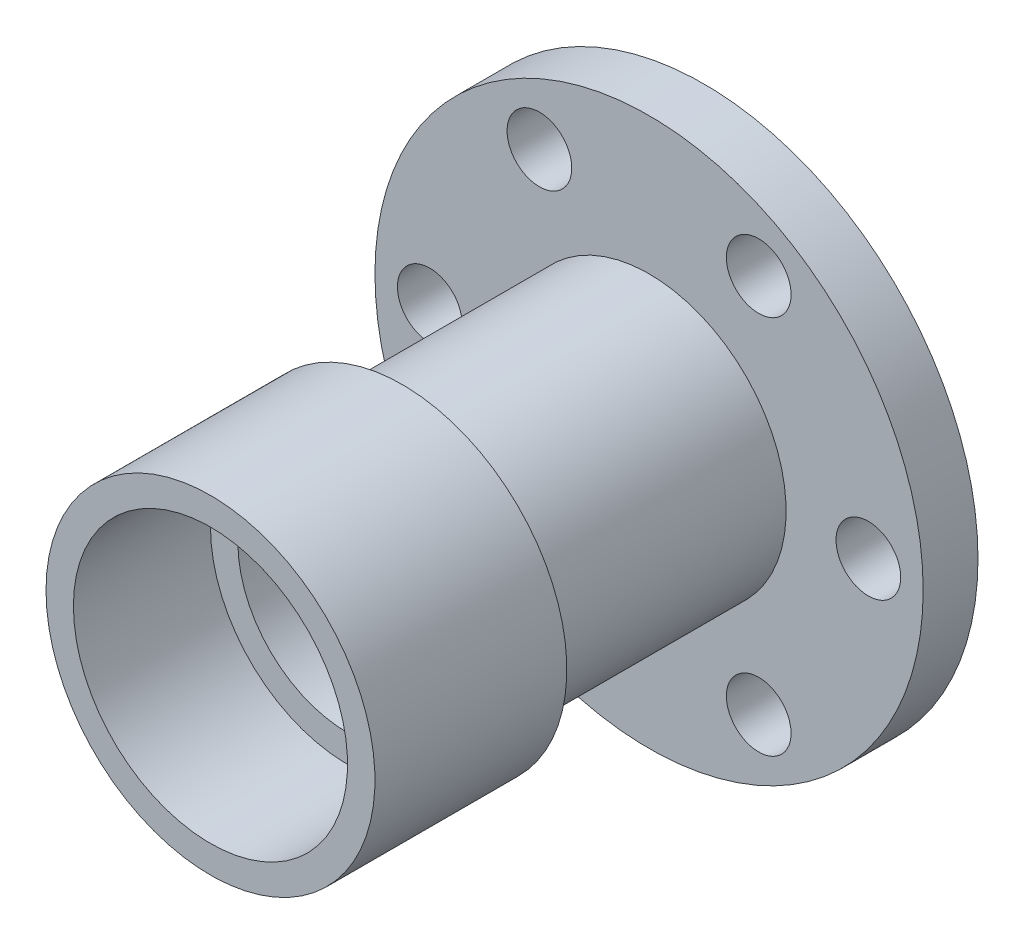
ISO-10303-21;
HEADER;
FILE_DESCRIPTION(('STEP AP214'),'2;1');
FILE_NAME('part.step','',(''),(''),'','','');
FILE_SCHEMA(('AUTOMOTIVE_DESIGN { 1 0 10303 214 1 1 1 1 }'));
ENDSEC;
DATA;
#1=APPLICATION_CONTEXT('core data for automotive mechanical design processes');
#2=APPLICATION_PROTOCOL_DEFINITION('international standard','automotive_design',2000,#1);
#3=PRODUCT_CONTEXT('',#1,'mechanical');
#4=PRODUCT('Part','Part','',(#3));
#5=PRODUCT_RELATED_PRODUCT_CATEGORY('part','',(#4));
#6=PRODUCT_DEFINITION_FORMATION('','',#4);
#7=PRODUCT_DEFINITION_CONTEXT('part definition',#1,'design');
#8=PRODUCT_DEFINITION('design','',#6,#7);
#9=PRODUCT_DEFINITION_SHAPE('','',#8);
#10=(LENGTH_UNIT() NAMED_UNIT(*) SI_UNIT(.MILLI.,.METRE.));
#11=(NAMED_UNIT(*) PLANE_ANGLE_UNIT() SI_UNIT($,.RADIAN.));
#12=(NAMED_UNIT(*) SI_UNIT($,.STERADIAN.) SOLID_ANGLE_UNIT());
#13=UNCERTAINTY_MEASURE_WITH_UNIT(LENGTH_MEASURE(1.E-05),#10,'distance_accuracy_value','');
#14=(GEOMETRIC_REPRESENTATION_CONTEXT(3) GLOBAL_UNCERTAINTY_ASSIGNED_CONTEXT((#13)) GLOBAL_UNIT_ASSIGNED_CONTEXT((#10,
#11,#12)) REPRESENTATION_CONTEXT('',''));
#15=CARTESIAN_POINT('',(0.,0.,0.));
#16=DIRECTION('',(0.,0.,1.));
#17=DIRECTION('',(1.,0.,0.));
#18=AXIS2_PLACEMENT_3D('',#15,#16,#17);
#19=CARTESIAN_POINT('',(0.,0.,0.));
#20=DIRECTION('',(0.,0.,-1.));
#21=DIRECTION('',(-1.,0.,0.));
#22=AXIS2_PLACEMENT_3D('',#19,#20,#21);
#23=CYLINDRICAL_SURFACE('',#22,50.);
#24=CARTESIAN_POINT('',(0.,0.,10.));
#25=DIRECTION('',(0.,0.,-1.));
#26=DIRECTION('',(-1.,0.,0.));
#27=AXIS2_PLACEMENT_3D('',#24,#25,#26);
#28=CIRCLE('',#27,50.);
#29=CARTESIAN_POINT('',(-50.,0.,10.));
#30=VERTEX_POINT('',#29);
#31=EDGE_CURVE('E10',#30,#30,#28,.T.);
#32=ORIENTED_EDGE('',*,*,#31,.T.);
#33=EDGE_LOOP('',(#32));
#34=FACE_BOUND('',#33,.T.);
#35=CARTESIAN_POINT('',(0.,0.,0.));
#36=DIRECTION('',(0.,0.,-1.));
#37=DIRECTION('',(-1.,0.,0.));
#38=AXIS2_PLACEMENT_3D('',#35,#36,#37);
#39=CIRCLE('',#38,50.);
#40=CARTESIAN_POINT('',(-50.,0.,0.));
#41=VERTEX_POINT('',#40);
#42=EDGE_CURVE('E69',#41,#41,#39,.T.);
#43=ORIENTED_EDGE('',*,*,#42,.F.);
#44=EDGE_LOOP('',(#43));
#45=FACE_BOUND('',#44,.T.);
#46=ADVANCED_FACE('F35',(#34,#45),#23,.T.);
#47=CARTESIAN_POINT('',(0.,50.,10.));
#48=DIRECTION('',(0.,0.,1.));
#49=DIRECTION('',(1.,0.,0.));
#50=AXIS2_PLACEMENT_3D('',#47,#48,#49);
#51=PLANE('',#50);
#52=CARTESIAN_POINT('',(40.,0.,10.));
#53=DIRECTION('',(0.,0.,1.));
#54=DIRECTION('',(1.,0.,0.));
#55=AXIS2_PLACEMENT_3D('',#52,#53,#54);
#56=CIRCLE('',#55,5.9);
#57=CARTESIAN_POINT('',(45.9,0.,10.));
#58=VERTEX_POINT('',#57);
#59=EDGE_CURVE('E96',#58,#58,#56,.T.);
#60=ORIENTED_EDGE('',*,*,#59,.F.);
#61=EDGE_LOOP('',(#60));
#62=FACE_BOUND('',#61,.T.);
#63=CARTESIAN_POINT('',(20.0000000000004,34.6410161513773,10.));
#64=DIRECTION('',(0.,0.,1.));
#65=DIRECTION('',(1.,0.,0.));
#66=AXIS2_PLACEMENT_3D('',#63,#64,#65);
#67=CIRCLE('',#66,5.9);
#68=CARTESIAN_POINT('',(25.9000000000004,34.6410161513773,10.));
#69=VERTEX_POINT('',#68);
#70=EDGE_CURVE('E101',#69,#69,#67,.T.);
#71=ORIENTED_EDGE('',*,*,#70,.F.);
#72=EDGE_LOOP('',(#71));
#73=FACE_BOUND('',#72,.T.);
#74=CARTESIAN_POINT('',(-20.,34.6410161513775,10.));
#75=DIRECTION('',(0.,0.,1.));
#76=DIRECTION('',(1.,0.,0.));
#77=AXIS2_PLACEMENT_3D('',#74,#75,#76);
#78=CIRCLE('',#77,5.89999999999988);
#79=CARTESIAN_POINT('',(-14.1000000000001,34.6410161513775,10.));
#80=VERTEX_POINT('',#79);
#81=EDGE_CURVE('E77',#80,#80,#78,.T.);
#82=ORIENTED_EDGE('',*,*,#81,.F.);
#83=EDGE_LOOP('',(#82));
#84=FACE_BOUND('',#83,.T.);
#85=CARTESIAN_POINT('',(-40.,2.79318507107451E-13,10.));
#86=DIRECTION('',(0.,0.,1.));
#87=DIRECTION('',(1.,0.,0.));
#88=AXIS2_PLACEMENT_3D('',#85,#86,#87);
#89=CIRCLE('',#88,5.9);
#90=CARTESIAN_POINT('',(-34.1,2.79318507107451E-13,10.));
#91=VERTEX_POINT('',#90);
#92=EDGE_CURVE('E76',#91,#91,#89,.T.);
#93=ORIENTED_EDGE('',*,*,#92,.F.);
#94=EDGE_LOOP('',(#93));
#95=FACE_BOUND('',#94,.T.);
#96=CARTESIAN_POINT('',(-20.0000000000002,-34.6410161513775,10.));
#97=DIRECTION('',(0.,0.,1.));
#98=DIRECTION('',(1.,0.,0.));
#99=AXIS2_PLACEMENT_3D('',#96,#97,#98);
#100=CIRCLE('',#99,5.9);
#101=CARTESIAN_POINT('',(-14.1000000000002,-34.6410161513775,10.));
#102=VERTEX_POINT('',#101);
#103=EDGE_CURVE('E84',#102,#102,#100,.T.);
#104=ORIENTED_EDGE('',*,*,#103,.F.);
#105=EDGE_LOOP('',(#104));
#106=FACE_BOUND('',#105,.T.);
#107=CARTESIAN_POINT('',(19.9999999999999,-34.6410161513776,10.));
#108=DIRECTION('',(0.,0.,1.));
#109=DIRECTION('',(1.,0.,0.));
#110=AXIS2_PLACEMENT_3D('',#107,#108,#109);
#111=CIRCLE('',#110,5.9);
#112=CARTESIAN_POINT('',(25.8999999999999,-34.6410161513776,10.));
#113=VERTEX_POINT('',#112);
#114=EDGE_CURVE('E90',#113,#113,#111,.T.);
#115=ORIENTED_EDGE('',*,*,#114,.F.);
#116=EDGE_LOOP('',(#115));
#117=FACE_BOUND('',#116,.T.);
#118=CARTESIAN_POINT('',(0.,0.,10.));
#119=DIRECTION('',(0.,0.,-1.));
#120=DIRECTION('',(-1.,0.,0.));
#121=AXIS2_PLACEMENT_3D('',#118,#119,#120);
#122=CIRCLE('',#121,25.);
#123=CARTESIAN_POINT('',(-25.,0.,10.));
#124=VERTEX_POINT('',#123);
#125=EDGE_CURVE('E41',#124,#124,#122,.T.);
#126=ORIENTED_EDGE('',*,*,#125,.T.);
#127=EDGE_LOOP('',(#126));
#128=FACE_BOUND('',#127,.T.);
#129=ORIENTED_EDGE('',*,*,#31,.F.);
#130=EDGE_LOOP('',(#129));
#131=FACE_BOUND('',#130,.T.);
#132=ADVANCED_FACE('F112',(#62,#73,#84,#95,#106,#117,#128,#131),#51,.T.);
#133=CARTESIAN_POINT('',(0.,0.,0.));
#134=DIRECTION('',(0.,0.,-1.));
#135=DIRECTION('',(-1.,0.,0.));
#136=AXIS2_PLACEMENT_3D('',#133,#134,#135);
#137=CYLINDRICAL_SURFACE('',#136,25.);
#138=CARTESIAN_POINT('',(0.,0.,55.));
#139=DIRECTION('',(0.,0.,-1.));
#140=DIRECTION('',(-1.,0.,0.));
#141=AXIS2_PLACEMENT_3D('',#138,#139,#140);
#142=CIRCLE('',#141,25.);
#143=CARTESIAN_POINT('',(-25.,0.,55.));
#144=VERTEX_POINT('',#143);
#145=EDGE_CURVE('E45',#144,#144,#142,.T.);
#146=ORIENTED_EDGE('',*,*,#145,.T.);
#147=EDGE_LOOP('',(#146));
#148=FACE_BOUND('',#147,.T.);
#149=ORIENTED_EDGE('',*,*,#125,.F.);
#150=EDGE_LOOP('',(#149));
#151=FACE_BOUND('',#150,.T.);
#152=ADVANCED_FACE('F115',(#148,#151),#137,.T.);
#153=CARTESIAN_POINT('',(0.,25.,55.));
#154=DIRECTION('',(0.,0.,-1.));
#155=DIRECTION('',(-1.,0.,0.));
#156=AXIS2_PLACEMENT_3D('',#153,#154,#155);
#157=PLANE('',#156);
#158=CARTESIAN_POINT('',(0.,0.,55.));
#159=DIRECTION('',(0.,0.,-1.));
#160=DIRECTION('',(-1.,0.,0.));
#161=AXIS2_PLACEMENT_3D('',#158,#159,#160);
#162=CIRCLE('',#161,30.);
#163=CARTESIAN_POINT('',(-30.,0.,55.));
#164=VERTEX_POINT('',#163);
#165=EDGE_CURVE('E49',#164,#164,#162,.T.);
#166=ORIENTED_EDGE('',*,*,#165,.T.);
#167=EDGE_LOOP('',(#166));
#168=FACE_BOUND('',#167,.T.);
#169=ORIENTED_EDGE('',*,*,#145,.F.);
#170=EDGE_LOOP('',(#169));
#171=FACE_BOUND('',#170,.T.);
#172=ADVANCED_FACE('F170',(#168,#171),#157,.T.);
#173=CARTESIAN_POINT('',(0.,0.,0.));
#174=DIRECTION('',(0.,0.,-1.));
#175=DIRECTION('',(-1.,0.,0.));
#176=AXIS2_PLACEMENT_3D('',#173,#174,#175);
#177=CYLINDRICAL_SURFACE('',#176,30.);
#178=CARTESIAN_POINT('',(0.,0.,90.));
#179=DIRECTION('',(0.,0.,-1.));
#180=DIRECTION('',(-1.,0.,0.));
#181=AXIS2_PLACEMENT_3D('',#178,#179,#180);
#182=CIRCLE('',#181,30.);
#183=CARTESIAN_POINT('',(-30.,0.,90.));
#184=VERTEX_POINT('',#183);
#185=EDGE_CURVE('E54',#184,#184,#182,.T.);
#186=ORIENTED_EDGE('',*,*,#185,.T.);
#187=EDGE_LOOP('',(#186));
#188=FACE_BOUND('',#187,.T.);
#189=ORIENTED_EDGE('',*,*,#165,.F.);
#190=EDGE_LOOP('',(#189));
#191=FACE_BOUND('',#190,.T.);
#192=ADVANCED_FACE('F164',(#188,#191),#177,.T.);
#193=CARTESIAN_POINT('',(0.,30.,90.));
#194=DIRECTION('',(0.,0.,1.));
#195=DIRECTION('',(1.,0.,0.));
#196=AXIS2_PLACEMENT_3D('',#193,#194,#195);
#197=PLANE('',#196);
#198=CARTESIAN_POINT('',(0.,0.,90.));
#199=DIRECTION('',(0.,0.,-1.));
#200=DIRECTION('',(-1.,0.,0.));
#201=AXIS2_PLACEMENT_3D('',#198,#199,#200);
#202=CIRCLE('',#201,25.);
#203=CARTESIAN_POINT('',(-25.,0.,90.));
#204=VERTEX_POINT('',#203);
#205=EDGE_CURVE('E57',#204,#204,#202,.T.);
#206=ORIENTED_EDGE('',*,*,#205,.T.);
#207=EDGE_LOOP('',(#206));
#208=FACE_BOUND('',#207,.T.);
#209=ORIENTED_EDGE('',*,*,#185,.F.);
#210=EDGE_LOOP('',(#209));
#211=FACE_BOUND('',#210,.T.);
#212=ADVANCED_FACE('F158',(#208,#211),#197,.T.);
#213=CARTESIAN_POINT('',(0.,0.,0.));
#214=DIRECTION('',(0.,0.,-1.));
#215=DIRECTION('',(-1.,0.,0.));
#216=AXIS2_PLACEMENT_3D('',#213,#214,#215);
#217=CYLINDRICAL_SURFACE('',#216,25.);
#218=CARTESIAN_POINT('',(0.,0.,65.));
#219=DIRECTION('',(0.,0.,-1.));
#220=DIRECTION('',(-1.,0.,0.));
#221=AXIS2_PLACEMENT_3D('',#218,#219,#220);
#222=CIRCLE('',#221,25.);
#223=CARTESIAN_POINT('',(-25.,0.,65.));
#224=VERTEX_POINT('',#223);
#225=EDGE_CURVE('E60',#224,#224,#222,.T.);
#226=ORIENTED_EDGE('',*,*,#225,.T.);
#227=EDGE_LOOP('',(#226));
#228=FACE_BOUND('',#227,.T.);
#229=ORIENTED_EDGE('',*,*,#205,.F.);
#230=EDGE_LOOP('',(#229));
#231=FACE_BOUND('',#230,.T.);
#232=ADVANCED_FACE('F152',(#228,#231),#217,.F.);
#233=CARTESIAN_POINT('',(0.,25.,65.));
#234=DIRECTION('',(0.,0.,1.));
#235=DIRECTION('',(1.,0.,0.));
#236=AXIS2_PLACEMENT_3D('',#233,#234,#235);
#237=PLANE('',#236);
#238=CARTESIAN_POINT('',(0.,0.,65.));
#239=DIRECTION('',(0.,0.,-1.));
#240=DIRECTION('',(-1.,0.,0.));
#241=AXIS2_PLACEMENT_3D('',#238,#239,#240);
#242=CIRCLE('',#241,20.);
#243=CARTESIAN_POINT('',(-20.,0.,65.));
#244=VERTEX_POINT('',#243);
#245=EDGE_CURVE('E63',#244,#244,#242,.T.);
#246=ORIENTED_EDGE('',*,*,#245,.T.);
#247=EDGE_LOOP('',(#246));
#248=FACE_BOUND('',#247,.T.);
#249=ORIENTED_EDGE('',*,*,#225,.F.);
#250=EDGE_LOOP('',(#249));
#251=FACE_BOUND('',#250,.T.);
#252=ADVANCED_FACE('F146',(#248,#251),#237,.T.);
#253=CARTESIAN_POINT('',(0.,0.,0.));
#254=DIRECTION('',(0.,0.,-1.));
#255=DIRECTION('',(-1.,0.,0.));
#256=AXIS2_PLACEMENT_3D('',#253,#254,#255);
#257=CYLINDRICAL_SURFACE('',#256,20.);
#258=CARTESIAN_POINT('',(0.,0.,0.));
#259=DIRECTION('',(0.,0.,-1.));
#260=DIRECTION('',(-1.,0.,0.));
#261=AXIS2_PLACEMENT_3D('',#258,#259,#260);
#262=CIRCLE('',#261,20.);
#263=CARTESIAN_POINT('',(-20.,0.,0.));
#264=VERTEX_POINT('',#263);
#265=EDGE_CURVE('E66',#264,#264,#262,.T.);
#266=ORIENTED_EDGE('',*,*,#265,.T.);
#267=EDGE_LOOP('',(#266));
#268=FACE_BOUND('',#267,.T.);
#269=ORIENTED_EDGE('',*,*,#245,.F.);
#270=EDGE_LOOP('',(#269));
#271=FACE_BOUND('',#270,.T.);
#272=ADVANCED_FACE('F137',(#268,#271),#257,.F.);
#273=CARTESIAN_POINT('',(0.,20.,0.));
#274=DIRECTION('',(0.,0.,-1.));
#275=DIRECTION('',(-1.,0.,0.));
#276=AXIS2_PLACEMENT_3D('',#273,#274,#275);
#277=PLANE('',#276);
#278=CARTESIAN_POINT('',(40.,0.,0.));
#279=DIRECTION('',(0.,0.,-1.));
#280=DIRECTION('',(-1.,0.,0.));
#281=AXIS2_PLACEMENT_3D('',#278,#279,#280);
#282=CIRCLE('',#281,5.9);
#283=CARTESIAN_POINT('',(45.9,0.,0.));
#284=VERTEX_POINT('',#283);
#285=EDGE_CURVE('E72',#284,#284,#282,.F.);
#286=ORIENTED_EDGE('',*,*,#285,.T.);
#287=EDGE_LOOP('',(#286));
#288=FACE_BOUND('',#287,.T.);
#289=CARTESIAN_POINT('',(20.0000000000004,34.6410161513773,0.));
#290=DIRECTION('',(0.,0.,-1.));
#291=DIRECTION('',(-1.,0.,0.));
#292=AXIS2_PLACEMENT_3D('',#289,#290,#291);
#293=CIRCLE('',#292,5.9);
#294=CARTESIAN_POINT('',(25.9000000000004,34.6410161513773,0.));
#295=VERTEX_POINT('',#294);
#296=EDGE_CURVE('E80',#295,#295,#293,.F.);
#297=ORIENTED_EDGE('',*,*,#296,.T.);
#298=EDGE_LOOP('',(#297));
#299=FACE_BOUND('',#298,.T.);
#300=CARTESIAN_POINT('',(-20.,34.6410161513775,0.));
#301=DIRECTION('',(0.,0.,-1.));
#302=DIRECTION('',(-1.,0.,0.));
#303=AXIS2_PLACEMENT_3D('',#300,#301,#302);
#304=CIRCLE('',#303,5.89999999999988);
#305=CARTESIAN_POINT('',(-14.1000000000001,34.6410161513775,0.));
#306=VERTEX_POINT('',#305);
#307=EDGE_CURVE('E73',#306,#306,#304,.F.);
#308=ORIENTED_EDGE('',*,*,#307,.T.);
#309=EDGE_LOOP('',(#308));
#310=FACE_BOUND('',#309,.T.);
#311=CARTESIAN_POINT('',(-40.,2.79318507107451E-13,0.));
#312=DIRECTION('',(0.,0.,-1.));
#313=DIRECTION('',(-1.,0.,0.));
#314=AXIS2_PLACEMENT_3D('',#311,#312,#313);
#315=CIRCLE('',#314,5.9);
#316=CARTESIAN_POINT('',(-34.1,2.79318507107451E-13,0.));
#317=VERTEX_POINT('',#316);
#318=EDGE_CURVE('E81',#317,#317,#315,.F.);
#319=ORIENTED_EDGE('',*,*,#318,.T.);
#320=EDGE_LOOP('',(#319));
#321=FACE_BOUND('',#320,.T.);
#322=CARTESIAN_POINT('',(-20.0000000000002,-34.6410161513775,0.));
#323=DIRECTION('',(0.,0.,-1.));
#324=DIRECTION('',(-1.,0.,0.));
#325=AXIS2_PLACEMENT_3D('',#322,#323,#324);
#326=CIRCLE('',#325,5.9);
#327=CARTESIAN_POINT('',(-14.1000000000002,-34.6410161513775,0.));
#328=VERTEX_POINT('',#327);
#329=EDGE_CURVE('E87',#328,#328,#326,.F.);
#330=ORIENTED_EDGE('',*,*,#329,.T.);
#331=EDGE_LOOP('',(#330));
#332=FACE_BOUND('',#331,.T.);
#333=CARTESIAN_POINT('',(19.9999999999999,-34.6410161513776,0.));
#334=DIRECTION('',(0.,0.,-1.));
#335=DIRECTION('',(-1.,0.,0.));
#336=AXIS2_PLACEMENT_3D('',#333,#334,#335);
#337=CIRCLE('',#336,5.9);
#338=CARTESIAN_POINT('',(25.8999999999999,-34.6410161513776,0.));
#339=VERTEX_POINT('',#338);
#340=EDGE_CURVE('E93',#339,#339,#337,.F.);
#341=ORIENTED_EDGE('',*,*,#340,.T.);
#342=EDGE_LOOP('',(#341));
#343=FACE_BOUND('',#342,.T.);
#344=ORIENTED_EDGE('',*,*,#42,.T.);
#345=EDGE_LOOP('',(#344));
#346=FACE_BOUND('',#345,.T.);
#347=ORIENTED_EDGE('',*,*,#265,.F.);
#348=EDGE_LOOP('',(#347));
#349=FACE_BOUND('',#348,.T.);
#350=ADVANCED_FACE('F131',(#288,#299,#310,#321,#332,#343,#346,#349),#277,.T.);
#351=CARTESIAN_POINT('',(19.9999999999999,-34.6410161513776,-16.6877200360025));
#352=DIRECTION('',(0.,0.,1.));
#353=DIRECTION('',(1.,0.,0.));
#354=AXIS2_PLACEMENT_3D('',#351,#352,#353);
#355=CYLINDRICAL_SURFACE('',#354,5.9);
#356=CARTESIAN_POINT('',(25.8999999999999,-34.6410161513776,10.));
#357=CARTESIAN_POINT('',(25.8999999999999,-34.6410161513776,9.89583333333333));
#358=CARTESIAN_POINT('',(25.8999999999999,-34.6410161513776,9.79166666666667));
#359=CARTESIAN_POINT('',(25.8999999999999,-34.6410161513776,9.58333333333333));
#360=CARTESIAN_POINT('',(25.8999999999999,-34.6410161513776,9.47916666666667));
#361=CARTESIAN_POINT('',(25.8999999999999,-34.6410161513776,9.27083333333333));
#362=CARTESIAN_POINT('',(25.8999999999999,-34.6410161513776,9.16666666666666));
#363=CARTESIAN_POINT('',(25.8999999999999,-34.6410161513776,8.95833333333333));
#364=CARTESIAN_POINT('',(25.8999999999999,-34.6410161513776,8.85416666666666));
#365=CARTESIAN_POINT('',(25.8999999999999,-34.6410161513776,8.64583333333333));
#366=CARTESIAN_POINT('',(25.8999999999999,-34.6410161513776,8.54166666666667));
#367=CARTESIAN_POINT('',(25.8999999999999,-34.6410161513776,8.33333333333333));
#368=CARTESIAN_POINT('',(25.8999999999999,-34.6410161513776,8.22916666666667));
#369=CARTESIAN_POINT('',(25.8999999999999,-34.6410161513776,8.02083333333333));
#370=CARTESIAN_POINT('',(25.8999999999999,-34.6410161513776,7.91666666666667));
#371=CARTESIAN_POINT('',(25.8999999999999,-34.6410161513776,7.70833333333333));
#372=CARTESIAN_POINT('',(25.8999999999999,-34.6410161513776,7.60416666666667));
#373=CARTESIAN_POINT('',(25.8999999999999,-34.6410161513776,7.39583333333333));
#374=CARTESIAN_POINT('',(25.8999999999999,-34.6410161513776,7.29166666666667));
#375=CARTESIAN_POINT('',(25.8999999999999,-34.6410161513776,7.08333333333333));
#376=CARTESIAN_POINT('',(25.8999999999999,-34.6410161513776,6.97916666666667));
#377=CARTESIAN_POINT('',(25.8999999999999,-34.6410161513776,6.77083333333333));
#378=CARTESIAN_POINT('',(25.8999999999999,-34.6410161513776,6.66666666666667));
#379=CARTESIAN_POINT('',(25.8999999999999,-34.6410161513776,6.45833333333333));
#380=CARTESIAN_POINT('',(25.8999999999999,-34.6410161513776,6.35416666666667));
#381=CARTESIAN_POINT('',(25.8999999999999,-34.6410161513776,6.14583333333334));
#382=CARTESIAN_POINT('',(25.8999999999999,-34.6410161513776,6.04166666666667));
#383=CARTESIAN_POINT('',(25.8999999999999,-34.6410161513776,5.83333333333334));
#384=CARTESIAN_POINT('',(25.8999999999999,-34.6410161513776,5.72916666666667));
#385=CARTESIAN_POINT('',(25.8999999999999,-34.6410161513776,5.52083333333333));
#386=CARTESIAN_POINT('',(25.8999999999999,-34.6410161513776,5.41666666666667));
#387=CARTESIAN_POINT('',(25.8999999999999,-34.6410161513776,5.20833333333333));
#388=CARTESIAN_POINT('',(25.8999999999999,-34.6410161513776,5.10416666666667));
#389=CARTESIAN_POINT('',(25.8999999999999,-34.6410161513776,4.89583333333333));
#390=CARTESIAN_POINT('',(25.8999999999999,-34.6410161513776,4.79166666666667));
#391=CARTESIAN_POINT('',(25.8999999999999,-34.6410161513776,4.58333333333333));
#392=CARTESIAN_POINT('',(25.8999999999999,-34.6410161513776,4.47916666666667));
#393=CARTESIAN_POINT('',(25.8999999999999,-34.6410161513776,4.27083333333333));
#394=CARTESIAN_POINT('',(25.8999999999999,-34.6410161513776,4.16666666666667));
#395=CARTESIAN_POINT('',(25.8999999999999,-34.6410161513776,3.95833333333333));
#396=CARTESIAN_POINT('',(25.8999999999999,-34.6410161513776,3.85416666666667));
#397=CARTESIAN_POINT('',(25.8999999999999,-34.6410161513776,3.64583333333333));
#398=CARTESIAN_POINT('',(25.8999999999999,-34.6410161513776,3.54166666666667));
#399=CARTESIAN_POINT('',(25.8999999999999,-34.6410161513776,3.33333333333333));
#400=CARTESIAN_POINT('',(25.8999999999999,-34.6410161513776,3.22916666666667));
#401=CARTESIAN_POINT('',(25.8999999999999,-34.6410161513776,3.02083333333334));
#402=CARTESIAN_POINT('',(25.8999999999999,-34.6410161513776,2.91666666666667));
#403=CARTESIAN_POINT('',(25.8999999999999,-34.6410161513776,2.70833333333334));
#404=CARTESIAN_POINT('',(25.8999999999999,-34.6410161513776,2.60416666666667));
#405=CARTESIAN_POINT('',(25.8999999999999,-34.6410161513776,2.39583333333334));
#406=CARTESIAN_POINT('',(25.8999999999999,-34.6410161513776,2.29166666666667));
#407=CARTESIAN_POINT('',(25.8999999999999,-34.6410161513776,2.08333333333334));
#408=CARTESIAN_POINT('',(25.8999999999999,-34.6410161513776,1.97916666666667));
#409=CARTESIAN_POINT('',(25.8999999999999,-34.6410161513776,1.77083333333334));
#410=CARTESIAN_POINT('',(25.8999999999999,-34.6410161513776,1.66666666666667));
#411=CARTESIAN_POINT('',(25.8999999999999,-34.6410161513776,1.45833333333334));
#412=CARTESIAN_POINT('',(25.8999999999999,-34.6410161513776,1.35416666666667));
#413=CARTESIAN_POINT('',(25.8999999999999,-34.6410161513776,1.14583333333334));
#414=CARTESIAN_POINT('',(25.8999999999999,-34.6410161513776,1.04166666666667));
#415=CARTESIAN_POINT('',(25.8999999999999,-34.6410161513776,0.833333333333338));
#416=CARTESIAN_POINT('',(25.8999999999999,-34.6410161513776,0.729166666666671));
#417=CARTESIAN_POINT('',(25.8999999999999,-34.6410161513776,0.520833333333337));
#418=CARTESIAN_POINT('',(25.8999999999999,-34.6410161513776,0.41666666666667));
#419=CARTESIAN_POINT('',(25.8999999999999,-34.6410161513776,0.208333333333337));
#420=CARTESIAN_POINT('',(25.8999999999999,-34.6410161513776,0.10416666666667));
#421=CARTESIAN_POINT('',(25.8999999999999,-34.6410161513776,0.));
#422=B_SPLINE_CURVE_WITH_KNOTS('',3,(#356,#357,#358,#359,#360,#361,#362,#363,#364,#365,#366,
#367,#368,#369,#370,#371,#372,#373,#374,#375,#376,#377,#378,#379,#380,#381,#382,#383,#384,#385,
#386,#387,#388,#389,#390,#391,#392,#393,#394,#395,#396,#397,#398,#399,#400,#401,#402,#403,#404,
#405,#406,#407,#408,#409,#410,#411,#412,#413,#414,#415,#416,#417,#418,#419,#420,#421),
.UNSPECIFIED.,.F.,.F.,(4,2,2,2,2,2,2,2,2,2,2,2,2,2,2,2,2,2,2,2,2,2,2,2,2,2,2,2,2,2,2,2,4),(0.,
0.3125,0.625000000000001,0.937500000000001,1.25,1.5625,1.875,2.1875,2.5,2.8125,3.125,3.4375,
3.75,4.0625,4.375,4.6875,5.,5.3125,5.625,5.9375,6.25,6.5625,6.875,7.1875,7.5,7.8125,8.125,
8.43749999999999,8.74999999999999,9.06249999999999,9.37499999999999,9.68749999999999,
9.99999999999999),.UNSPECIFIED.);
#423=EDGE_CURVE('BSEAM127',#113,#339,#422,.T.);
#424=ORIENTED_EDGE('',*,*,#114,.T.);
#425=ORIENTED_EDGE('',*,*,#340,.F.);
#426=ORIENTED_EDGE('',*,*,#423,.T.);
#427=ORIENTED_EDGE('',*,*,#423,.F.);
#428=EDGE_LOOP('',(#424,#426,#425,#427));
#429=FACE_BOUND('',#428,.T.);
#430=ADVANCED_FACE('F127',(#429),#355,.F.);
#431=CARTESIAN_POINT('',(-20.0000000000002,-34.6410161513775,-16.6877200360025));
#432=DIRECTION('',(0.,0.,1.));
#433=DIRECTION('',(1.,0.,0.));
#434=AXIS2_PLACEMENT_3D('',#431,#432,#433);
#435=CYLINDRICAL_SURFACE('',#434,5.9);
#436=CARTESIAN_POINT('',(-14.1000000000002,-34.6410161513775,10.));
#437=CARTESIAN_POINT('',(-14.1000000000002,-34.6410161513775,9.89583333333333));
#438=CARTESIAN_POINT('',(-14.1000000000002,-34.6410161513775,9.79166666666667));
#439=CARTESIAN_POINT('',(-14.1000000000002,-34.6410161513775,9.58333333333333));
#440=CARTESIAN_POINT('',(-14.1000000000002,-34.6410161513775,9.47916666666667));
#441=CARTESIAN_POINT('',(-14.1000000000002,-34.6410161513775,9.27083333333333));
#442=CARTESIAN_POINT('',(-14.1000000000002,-34.6410161513775,9.16666666666666));
#443=CARTESIAN_POINT('',(-14.1000000000002,-34.6410161513775,8.95833333333333));
#444=CARTESIAN_POINT('',(-14.1000000000002,-34.6410161513775,8.85416666666666));
#445=CARTESIAN_POINT('',(-14.1000000000002,-34.6410161513775,8.64583333333333));
#446=CARTESIAN_POINT('',(-14.1000000000002,-34.6410161513775,8.54166666666667));
#447=CARTESIAN_POINT('',(-14.1000000000002,-34.6410161513775,8.33333333333333));
#448=CARTESIAN_POINT('',(-14.1000000000002,-34.6410161513775,8.22916666666667));
#449=CARTESIAN_POINT('',(-14.1000000000002,-34.6410161513775,8.02083333333333));
#450=CARTESIAN_POINT('',(-14.1000000000002,-34.6410161513775,7.91666666666667));
#451=CARTESIAN_POINT('',(-14.1000000000002,-34.6410161513775,7.70833333333333));
#452=CARTESIAN_POINT('',(-14.1000000000002,-34.6410161513775,7.60416666666667));
#453=CARTESIAN_POINT('',(-14.1000000000002,-34.6410161513775,7.39583333333333));
#454=CARTESIAN_POINT('',(-14.1000000000002,-34.6410161513775,7.29166666666667));
#455=CARTESIAN_POINT('',(-14.1000000000002,-34.6410161513775,7.08333333333333));
#456=CARTESIAN_POINT('',(-14.1000000000002,-34.6410161513775,6.97916666666667));
#457=CARTESIAN_POINT('',(-14.1000000000002,-34.6410161513775,6.77083333333333));
#458=CARTESIAN_POINT('',(-14.1000000000002,-34.6410161513775,6.66666666666667));
#459=CARTESIAN_POINT('',(-14.1000000000002,-34.6410161513775,6.45833333333333));
#460=CARTESIAN_POINT('',(-14.1000000000002,-34.6410161513775,6.35416666666667));
#461=CARTESIAN_POINT('',(-14.1000000000002,-34.6410161513775,6.14583333333334));
#462=CARTESIAN_POINT('',(-14.1000000000002,-34.6410161513775,6.04166666666667));
#463=CARTESIAN_POINT('',(-14.1000000000002,-34.6410161513775,5.83333333333334));
#464=CARTESIAN_POINT('',(-14.1000000000002,-34.6410161513775,5.72916666666667));
#465=CARTESIAN_POINT('',(-14.1000000000002,-34.6410161513775,5.52083333333333));
#466=CARTESIAN_POINT('',(-14.1000000000002,-34.6410161513775,5.41666666666667));
#467=CARTESIAN_POINT('',(-14.1000000000002,-34.6410161513775,5.20833333333333));
#468=CARTESIAN_POINT('',(-14.1000000000002,-34.6410161513775,5.10416666666667));
#469=CARTESIAN_POINT('',(-14.1000000000002,-34.6410161513775,4.89583333333333));
#470=CARTESIAN_POINT('',(-14.1000000000002,-34.6410161513775,4.79166666666667));
#471=CARTESIAN_POINT('',(-14.1000000000002,-34.6410161513775,4.58333333333333));
#472=CARTESIAN_POINT('',(-14.1000000000002,-34.6410161513775,4.47916666666667));
#473=CARTESIAN_POINT('',(-14.1000000000002,-34.6410161513775,4.27083333333333));
#474=CARTESIAN_POINT('',(-14.1000000000002,-34.6410161513775,4.16666666666667));
#475=CARTESIAN_POINT('',(-14.1000000000002,-34.6410161513775,3.95833333333333));
#476=CARTESIAN_POINT('',(-14.1000000000002,-34.6410161513775,3.85416666666667));
#477=CARTESIAN_POINT('',(-14.1000000000002,-34.6410161513775,3.64583333333333));
#478=CARTESIAN_POINT('',(-14.1000000000002,-34.6410161513775,3.54166666666667));
#479=CARTESIAN_POINT('',(-14.1000000000002,-34.6410161513775,3.33333333333333));
#480=CARTESIAN_POINT('',(-14.1000000000002,-34.6410161513775,3.22916666666667));
#481=CARTESIAN_POINT('',(-14.1000000000002,-34.6410161513775,3.02083333333334));
#482=CARTESIAN_POINT('',(-14.1000000000002,-34.6410161513775,2.91666666666667));
#483=CARTESIAN_POINT('',(-14.1000000000002,-34.6410161513775,2.70833333333334));
#484=CARTESIAN_POINT('',(-14.1000000000002,-34.6410161513775,2.60416666666667));
#485=CARTESIAN_POINT('',(-14.1000000000002,-34.6410161513775,2.39583333333334));
#486=CARTESIAN_POINT('',(-14.1000000000002,-34.6410161513775,2.29166666666667));
#487=CARTESIAN_POINT('',(-14.1000000000002,-34.6410161513775,2.08333333333334));
#488=CARTESIAN_POINT('',(-14.1000000000002,-34.6410161513775,1.97916666666667));
#489=CARTESIAN_POINT('',(-14.1000000000002,-34.6410161513775,1.77083333333334));
#490=CARTESIAN_POINT('',(-14.1000000000002,-34.6410161513775,1.66666666666667));
#491=CARTESIAN_POINT('',(-14.1000000000002,-34.6410161513775,1.45833333333334));
#492=CARTESIAN_POINT('',(-14.1000000000002,-34.6410161513775,1.35416666666667));
#493=CARTESIAN_POINT('',(-14.1000000000002,-34.6410161513775,1.14583333333334));
#494=CARTESIAN_POINT('',(-14.1000000000002,-34.6410161513775,1.04166666666667));
#495=CARTESIAN_POINT('',(-14.1000000000002,-34.6410161513775,0.833333333333338));
#496=CARTESIAN_POINT('',(-14.1000000000002,-34.6410161513775,0.729166666666671));
#497=CARTESIAN_POINT('',(-14.1000000000002,-34.6410161513775,0.520833333333337));
#498=CARTESIAN_POINT('',(-14.1000000000002,-34.6410161513775,0.41666666666667));
#499=CARTESIAN_POINT('',(-14.1000000000002,-34.6410161513775,0.208333333333337));
#500=CARTESIAN_POINT('',(-14.1000000000002,-34.6410161513775,0.10416666666667));
#501=CARTESIAN_POINT('',(-14.1000000000002,-34.6410161513775,0.));
#502=B_SPLINE_CURVE_WITH_KNOTS('',3,(#436,#437,#438,#439,#440,#441,#442,#443,#444,#445,#446,
#447,#448,#449,#450,#451,#452,#453,#454,#455,#456,#457,#458,#459,#460,#461,#462,#463,#464,#465,
#466,#467,#468,#469,#470,#471,#472,#473,#474,#475,#476,#477,#478,#479,#480,#481,#482,#483,#484,
#485,#486,#487,#488,#489,#490,#491,#492,#493,#494,#495,#496,#497,#498,#499,#500,#501),
.UNSPECIFIED.,.F.,.F.,(4,2,2,2,2,2,2,2,2,2,2,2,2,2,2,2,2,2,2,2,2,2,2,2,2,2,2,2,2,2,2,2,4),(0.,
0.3125,0.625000000000001,0.937500000000001,1.25,1.5625,1.875,2.1875,2.5,2.8125,3.125,3.4375,
3.75,4.0625,4.375,4.6875,5.,5.3125,5.625,5.9375,6.25,6.5625,6.875,7.1875,7.5,7.8125,8.125,
8.43749999999999,8.74999999999999,9.06249999999999,9.37499999999999,9.68749999999999,
9.99999999999999),.UNSPECIFIED.);
#503=EDGE_CURVE('BSEAM130',#102,#328,#502,.T.);
#504=ORIENTED_EDGE('',*,*,#103,.T.);
#505=ORIENTED_EDGE('',*,*,#329,.F.);
#506=ORIENTED_EDGE('',*,*,#503,.T.);
#507=ORIENTED_EDGE('',*,*,#503,.F.);
#508=EDGE_LOOP('',(#504,#506,#505,#507));
#509=FACE_BOUND('',#508,.T.);
#510=ADVANCED_FACE('F130',(#509),#435,.F.);
#511=CARTESIAN_POINT('',(-40.,2.79318507107451E-13,-16.6877200360025));
#512=DIRECTION('',(0.,0.,1.));
#513=DIRECTION('',(1.,0.,0.));
#514=AXIS2_PLACEMENT_3D('',#511,#512,#513);
#515=CYLINDRICAL_SURFACE('',#514,5.9);
#516=CARTESIAN_POINT('',(-34.1,2.79318507107451E-13,10.));
#517=CARTESIAN_POINT('',(-34.1,2.79318507107451E-13,9.89583333333333));
#518=CARTESIAN_POINT('',(-34.1,2.79318507107451E-13,9.79166666666667));
#519=CARTESIAN_POINT('',(-34.1,2.79318507107451E-13,9.58333333333333));
#520=CARTESIAN_POINT('',(-34.1,2.79318507107451E-13,9.47916666666667));
#521=CARTESIAN_POINT('',(-34.1,2.79318507107451E-13,9.27083333333333));
#522=CARTESIAN_POINT('',(-34.1,2.79318507107451E-13,9.16666666666666));
#523=CARTESIAN_POINT('',(-34.1,2.79318507107451E-13,8.95833333333333));
#524=CARTESIAN_POINT('',(-34.1,2.79318507107451E-13,8.85416666666666));
#525=CARTESIAN_POINT('',(-34.1,2.79318507107451E-13,8.64583333333333));
#526=CARTESIAN_POINT('',(-34.1,2.79318507107451E-13,8.54166666666667));
#527=CARTESIAN_POINT('',(-34.1,2.79318507107451E-13,8.33333333333333));
#528=CARTESIAN_POINT('',(-34.1,2.79318507107451E-13,8.22916666666667));
#529=CARTESIAN_POINT('',(-34.1,2.79318507107451E-13,8.02083333333333));
#530=CARTESIAN_POINT('',(-34.1,2.79318507107451E-13,7.91666666666667));
#531=CARTESIAN_POINT('',(-34.1,2.79318507107451E-13,7.70833333333333));
#532=CARTESIAN_POINT('',(-34.1,2.79318507107451E-13,7.60416666666667));
#533=CARTESIAN_POINT('',(-34.1,2.79318507107451E-13,7.39583333333333));
#534=CARTESIAN_POINT('',(-34.1,2.79318507107451E-13,7.29166666666667));
#535=CARTESIAN_POINT('',(-34.1,2.79318507107451E-13,7.08333333333333));
#536=CARTESIAN_POINT('',(-34.1,2.79318507107451E-13,6.97916666666667));
#537=CARTESIAN_POINT('',(-34.1,2.79318507107451E-13,6.77083333333333));
#538=CARTESIAN_POINT('',(-34.1,2.79318507107451E-13,6.66666666666667));
#539=CARTESIAN_POINT('',(-34.1,2.79318507107451E-13,6.45833333333333));
#540=CARTESIAN_POINT('',(-34.1,2.79318507107451E-13,6.35416666666667));
#541=CARTESIAN_POINT('',(-34.1,2.79318507107451E-13,6.14583333333334));
#542=CARTESIAN_POINT('',(-34.1,2.79318507107451E-13,6.04166666666667));
#543=CARTESIAN_POINT('',(-34.1,2.79318507107451E-13,5.83333333333334));
#544=CARTESIAN_POINT('',(-34.1,2.79318507107451E-13,5.72916666666667));
#545=CARTESIAN_POINT('',(-34.1,2.79318507107451E-13,5.52083333333333));
#546=CARTESIAN_POINT('',(-34.1,2.79318507107451E-13,5.41666666666667));
#547=CARTESIAN_POINT('',(-34.1,2.79318507107451E-13,5.20833333333333));
#548=CARTESIAN_POINT('',(-34.1,2.79318507107451E-13,5.10416666666667));
#549=CARTESIAN_POINT('',(-34.1,2.79318507107451E-13,4.89583333333333));
#550=CARTESIAN_POINT('',(-34.1,2.79318507107451E-13,4.79166666666667));
#551=CARTESIAN_POINT('',(-34.1,2.79318507107451E-13,4.58333333333333));
#552=CARTESIAN_POINT('',(-34.1,2.79318507107451E-13,4.47916666666667));
#553=CARTESIAN_POINT('',(-34.1,2.79318507107451E-13,4.27083333333333));
#554=CARTESIAN_POINT('',(-34.1,2.79318507107451E-13,4.16666666666667));
#555=CARTESIAN_POINT('',(-34.1,2.79318507107451E-13,3.95833333333333));
#556=CARTESIAN_POINT('',(-34.1,2.79318507107451E-13,3.85416666666667));
#557=CARTESIAN_POINT('',(-34.1,2.79318507107451E-13,3.64583333333333));
#558=CARTESIAN_POINT('',(-34.1,2.79318507107451E-13,3.54166666666667));
#559=CARTESIAN_POINT('',(-34.1,2.79318507107451E-13,3.33333333333333));
#560=CARTESIAN_POINT('',(-34.1,2.79318507107451E-13,3.22916666666667));
#561=CARTESIAN_POINT('',(-34.1,2.79318507107451E-13,3.02083333333334));
#562=CARTESIAN_POINT('',(-34.1,2.79318507107451E-13,2.91666666666667));
#563=CARTESIAN_POINT('',(-34.1,2.79318507107451E-13,2.70833333333334));
#564=CARTESIAN_POINT('',(-34.1,2.79318507107451E-13,2.60416666666667));
#565=CARTESIAN_POINT('',(-34.1,2.79318507107451E-13,2.39583333333334));
#566=CARTESIAN_POINT('',(-34.1,2.79318507107451E-13,2.29166666666667));
#567=CARTESIAN_POINT('',(-34.1,2.79318507107451E-13,2.08333333333334));
#568=CARTESIAN_POINT('',(-34.1,2.79318507107451E-13,1.97916666666667));
#569=CARTESIAN_POINT('',(-34.1,2.79318507107451E-13,1.77083333333334));
#570=CARTESIAN_POINT('',(-34.1,2.79318507107451E-13,1.66666666666667));
#571=CARTESIAN_POINT('',(-34.1,2.79318507107451E-13,1.45833333333334));
#572=CARTESIAN_POINT('',(-34.1,2.79318507107451E-13,1.35416666666667));
#573=CARTESIAN_POINT('',(-34.1,2.79318507107451E-13,1.14583333333334));
#574=CARTESIAN_POINT('',(-34.1,2.79318507107451E-13,1.04166666666667));
#575=CARTESIAN_POINT('',(-34.1,2.79318507107451E-13,0.833333333333338));
#576=CARTESIAN_POINT('',(-34.1,2.79318507107451E-13,0.729166666666671));
#577=CARTESIAN_POINT('',(-34.1,2.79318507107451E-13,0.520833333333337));
#578=CARTESIAN_POINT('',(-34.1,2.79318507107451E-13,0.41666666666667));
#579=CARTESIAN_POINT('',(-34.1,2.79318507107451E-13,0.208333333333337));
#580=CARTESIAN_POINT('',(-34.1,2.79318507107451E-13,0.10416666666667));
#581=CARTESIAN_POINT('',(-34.1,2.79318507107451E-13,0.));
#582=B_SPLINE_CURVE_WITH_KNOTS('',3,(#516,#517,#518,#519,#520,#521,#522,#523,#524,#525,#526,
#527,#528,#529,#530,#531,#532,#533,#534,#535,#536,#537,#538,#539,#540,#541,#542,#543,#544,#545,
#546,#547,#548,#549,#550,#551,#552,#553,#554,#555,#556,#557,#558,#559,#560,#561,#562,#563,#564,
#565,#566,#567,#568,#569,#570,#571,#572,#573,#574,#575,#576,#577,#578,#579,#580,#581),
.UNSPECIFIED.,.F.,.F.,(4,2,2,2,2,2,2,2,2,2,2,2,2,2,2,2,2,2,2,2,2,2,2,2,2,2,2,2,2,2,2,2,4),(0.,
0.3125,0.625000000000001,0.937500000000001,1.25,1.5625,1.875,2.1875,2.5,2.8125,3.125,3.4375,
3.75,4.0625,4.375,4.6875,5.,5.3125,5.625,5.9375,6.25,6.5625,6.875,7.1875,7.5,7.8125,8.125,
8.43749999999999,8.74999999999999,9.06249999999999,9.37499999999999,9.68749999999999,
9.99999999999999),.UNSPECIFIED.);
#583=EDGE_CURVE('BSEAM218',#91,#317,#582,.T.);
#584=ORIENTED_EDGE('',*,*,#92,.T.);
#585=ORIENTED_EDGE('',*,*,#318,.F.);
#586=ORIENTED_EDGE('',*,*,#583,.T.);
#587=ORIENTED_EDGE('',*,*,#583,.F.);
#588=EDGE_LOOP('',(#584,#586,#585,#587));
#589=FACE_BOUND('',#588,.T.);
#590=ADVANCED_FACE('F218',(#589),#515,.F.);
#591=CARTESIAN_POINT('',(-20.,34.6410161513775,-16.6877200360025));
#592=DIRECTION('',(0.,0.,1.));
#593=DIRECTION('',(1.,0.,0.));
#594=AXIS2_PLACEMENT_3D('',#591,#592,#593);
#595=CYLINDRICAL_SURFACE('',#594,5.89999999999988);
#596=CARTESIAN_POINT('',(-14.1000000000001,34.6410161513775,10.));
#597=CARTESIAN_POINT('',(-14.1000000000001,34.6410161513775,9.89583333333333));
#598=CARTESIAN_POINT('',(-14.1000000000001,34.6410161513775,9.79166666666667));
#599=CARTESIAN_POINT('',(-14.1000000000001,34.6410161513775,9.58333333333333));
#600=CARTESIAN_POINT('',(-14.1000000000001,34.6410161513775,9.47916666666667));
#601=CARTESIAN_POINT('',(-14.1000000000001,34.6410161513775,9.27083333333333));
#602=CARTESIAN_POINT('',(-14.1000000000001,34.6410161513775,9.16666666666666));
#603=CARTESIAN_POINT('',(-14.1000000000001,34.6410161513775,8.95833333333333));
#604=CARTESIAN_POINT('',(-14.1000000000001,34.6410161513775,8.85416666666666));
#605=CARTESIAN_POINT('',(-14.1000000000001,34.6410161513775,8.64583333333333));
#606=CARTESIAN_POINT('',(-14.1000000000001,34.6410161513775,8.54166666666667));
#607=CARTESIAN_POINT('',(-14.1000000000001,34.6410161513775,8.33333333333333));
#608=CARTESIAN_POINT('',(-14.1000000000001,34.6410161513775,8.22916666666667));
#609=CARTESIAN_POINT('',(-14.1000000000001,34.6410161513775,8.02083333333333));
#610=CARTESIAN_POINT('',(-14.1000000000001,34.6410161513775,7.91666666666667));
#611=CARTESIAN_POINT('',(-14.1000000000001,34.6410161513775,7.70833333333333));
#612=CARTESIAN_POINT('',(-14.1000000000001,34.6410161513775,7.60416666666667));
#613=CARTESIAN_POINT('',(-14.1000000000001,34.6410161513775,7.39583333333333));
#614=CARTESIAN_POINT('',(-14.1000000000001,34.6410161513775,7.29166666666667));
#615=CARTESIAN_POINT('',(-14.1000000000001,34.6410161513775,7.08333333333333));
#616=CARTESIAN_POINT('',(-14.1000000000001,34.6410161513775,6.97916666666667));
#617=CARTESIAN_POINT('',(-14.1000000000001,34.6410161513775,6.77083333333333));
#618=CARTESIAN_POINT('',(-14.1000000000001,34.6410161513775,6.66666666666667));
#619=CARTESIAN_POINT('',(-14.1000000000001,34.6410161513775,6.45833333333333));
#620=CARTESIAN_POINT('',(-14.1000000000001,34.6410161513775,6.35416666666667));
#621=CARTESIAN_POINT('',(-14.1000000000001,34.6410161513775,6.14583333333334));
#622=CARTESIAN_POINT('',(-14.1000000000001,34.6410161513775,6.04166666666667));
#623=CARTESIAN_POINT('',(-14.1000000000001,34.6410161513775,5.83333333333334));
#624=CARTESIAN_POINT('',(-14.1000000000001,34.6410161513775,5.72916666666667));
#625=CARTESIAN_POINT('',(-14.1000000000001,34.6410161513775,5.52083333333333));
#626=CARTESIAN_POINT('',(-14.1000000000001,34.6410161513775,5.41666666666667));
#627=CARTESIAN_POINT('',(-14.1000000000001,34.6410161513775,5.20833333333333));
#628=CARTESIAN_POINT('',(-14.1000000000001,34.6410161513775,5.10416666666667));
#629=CARTESIAN_POINT('',(-14.1000000000001,34.6410161513775,4.89583333333333));
#630=CARTESIAN_POINT('',(-14.1000000000001,34.6410161513775,4.79166666666667));
#631=CARTESIAN_POINT('',(-14.1000000000001,34.6410161513775,4.58333333333333));
#632=CARTESIAN_POINT('',(-14.1000000000001,34.6410161513775,4.47916666666667));
#633=CARTESIAN_POINT('',(-14.1000000000001,34.6410161513775,4.27083333333333));
#634=CARTESIAN_POINT('',(-14.1000000000001,34.6410161513775,4.16666666666667));
#635=CARTESIAN_POINT('',(-14.1000000000001,34.6410161513775,3.95833333333333));
#636=CARTESIAN_POINT('',(-14.1000000000001,34.6410161513775,3.85416666666667));
#637=CARTESIAN_POINT('',(-14.1000000000001,34.6410161513775,3.64583333333333));
#638=CARTESIAN_POINT('',(-14.1000000000001,34.6410161513775,3.54166666666667));
#639=CARTESIAN_POINT('',(-14.1000000000001,34.6410161513775,3.33333333333333));
#640=CARTESIAN_POINT('',(-14.1000000000001,34.6410161513775,3.22916666666667));
#641=CARTESIAN_POINT('',(-14.1000000000001,34.6410161513775,3.02083333333334));
#642=CARTESIAN_POINT('',(-14.1000000000001,34.6410161513775,2.91666666666667));
#643=CARTESIAN_POINT('',(-14.1000000000001,34.6410161513775,2.70833333333334));
#644=CARTESIAN_POINT('',(-14.1000000000001,34.6410161513775,2.60416666666667));
#645=CARTESIAN_POINT('',(-14.1000000000001,34.6410161513775,2.39583333333334));
#646=CARTESIAN_POINT('',(-14.1000000000001,34.6410161513775,2.29166666666667));
#647=CARTESIAN_POINT('',(-14.1000000000001,34.6410161513775,2.08333333333334));
#648=CARTESIAN_POINT('',(-14.1000000000001,34.6410161513775,1.97916666666667));
#649=CARTESIAN_POINT('',(-14.1000000000001,34.6410161513775,1.77083333333334));
#650=CARTESIAN_POINT('',(-14.1000000000001,34.6410161513775,1.66666666666667));
#651=CARTESIAN_POINT('',(-14.1000000000001,34.6410161513775,1.45833333333334));
#652=CARTESIAN_POINT('',(-14.1000000000001,34.6410161513775,1.35416666666667));
#653=CARTESIAN_POINT('',(-14.1000000000001,34.6410161513775,1.14583333333334));
#654=CARTESIAN_POINT('',(-14.1000000000001,34.6410161513775,1.04166666666667));
#655=CARTESIAN_POINT('',(-14.1000000000001,34.6410161513775,0.833333333333338));
#656=CARTESIAN_POINT('',(-14.1000000000001,34.6410161513775,0.729166666666671));
#657=CARTESIAN_POINT('',(-14.1000000000001,34.6410161513775,0.520833333333337));
#658=CARTESIAN_POINT('',(-14.1000000000001,34.6410161513775,0.41666666666667));
#659=CARTESIAN_POINT('',(-14.1000000000001,34.6410161513775,0.208333333333337));
#660=CARTESIAN_POINT('',(-14.1000000000001,34.6410161513775,0.10416666666667));
#661=CARTESIAN_POINT('',(-14.1000000000001,34.6410161513775,0.));
#662=B_SPLINE_CURVE_WITH_KNOTS('',3,(#596,#597,#598,#599,#600,#601,#602,#603,#604,#605,#606,
#607,#608,#609,#610,#611,#612,#613,#614,#615,#616,#617,#618,#619,#620,#621,#622,#623,#624,#625,
#626,#627,#628,#629,#630,#631,#632,#633,#634,#635,#636,#637,#638,#639,#640,#641,#642,#643,#644,
#645,#646,#647,#648,#649,#650,#651,#652,#653,#654,#655,#656,#657,#658,#659,#660,#661),
.UNSPECIFIED.,.F.,.F.,(4,2,2,2,2,2,2,2,2,2,2,2,2,2,2,2,2,2,2,2,2,2,2,2,2,2,2,2,2,2,2,2,4),(0.,
0.3125,0.625000000000001,0.937500000000001,1.25,1.5625,1.875,2.1875,2.5,2.8125,3.125,3.4375,
3.75,4.0625,4.375,4.6875,5.,5.3125,5.625,5.9375,6.25,6.5625,6.875,7.1875,7.5,7.8125,8.125,
8.43749999999999,8.74999999999999,9.06249999999999,9.37499999999999,9.68749999999999,
9.99999999999999),.UNSPECIFIED.);
#663=EDGE_CURVE('BSEAM228',#80,#306,#662,.T.);
#664=ORIENTED_EDGE('',*,*,#81,.T.);
#665=ORIENTED_EDGE('',*,*,#307,.F.);
#666=ORIENTED_EDGE('',*,*,#663,.T.);
#667=ORIENTED_EDGE('',*,*,#663,.F.);
#668=EDGE_LOOP('',(#664,#666,#665,#667));
#669=FACE_BOUND('',#668,.T.);
#670=ADVANCED_FACE('F228',(#669),#595,.F.);
#671=CARTESIAN_POINT('',(20.0000000000004,34.6410161513773,-16.6877200360025));
#672=DIRECTION('',(0.,0.,1.));
#673=DIRECTION('',(1.,0.,0.));
#674=AXIS2_PLACEMENT_3D('',#671,#672,#673);
#675=CYLINDRICAL_SURFACE('',#674,5.9);
#676=CARTESIAN_POINT('',(25.9000000000004,34.6410161513773,10.));
#677=CARTESIAN_POINT('',(25.9000000000004,34.6410161513773,9.89583333333333));
#678=CARTESIAN_POINT('',(25.9000000000004,34.6410161513773,9.79166666666667));
#679=CARTESIAN_POINT('',(25.9000000000004,34.6410161513773,9.58333333333333));
#680=CARTESIAN_POINT('',(25.9000000000004,34.6410161513773,9.47916666666667));
#681=CARTESIAN_POINT('',(25.9000000000004,34.6410161513773,9.27083333333333));
#682=CARTESIAN_POINT('',(25.9000000000004,34.6410161513773,9.16666666666666));
#683=CARTESIAN_POINT('',(25.9000000000004,34.6410161513773,8.95833333333333));
#684=CARTESIAN_POINT('',(25.9000000000004,34.6410161513773,8.85416666666666));
#685=CARTESIAN_POINT('',(25.9000000000004,34.6410161513773,8.64583333333333));
#686=CARTESIAN_POINT('',(25.9000000000004,34.6410161513773,8.54166666666667));
#687=CARTESIAN_POINT('',(25.9000000000004,34.6410161513773,8.33333333333333));
#688=CARTESIAN_POINT('',(25.9000000000004,34.6410161513773,8.22916666666667));
#689=CARTESIAN_POINT('',(25.9000000000004,34.6410161513773,8.02083333333333));
#690=CARTESIAN_POINT('',(25.9000000000004,34.6410161513773,7.91666666666667));
#691=CARTESIAN_POINT('',(25.9000000000004,34.6410161513773,7.70833333333333));
#692=CARTESIAN_POINT('',(25.9000000000004,34.6410161513773,7.60416666666667));
#693=CARTESIAN_POINT('',(25.9000000000004,34.6410161513773,7.39583333333333));
#694=CARTESIAN_POINT('',(25.9000000000004,34.6410161513773,7.29166666666667));
#695=CARTESIAN_POINT('',(25.9000000000004,34.6410161513773,7.08333333333333));
#696=CARTESIAN_POINT('',(25.9000000000004,34.6410161513773,6.97916666666667));
#697=CARTESIAN_POINT('',(25.9000000000004,34.6410161513773,6.77083333333333));
#698=CARTESIAN_POINT('',(25.9000000000004,34.6410161513773,6.66666666666667));
#699=CARTESIAN_POINT('',(25.9000000000004,34.6410161513773,6.45833333333333));
#700=CARTESIAN_POINT('',(25.9000000000004,34.6410161513773,6.35416666666667));
#701=CARTESIAN_POINT('',(25.9000000000004,34.6410161513773,6.14583333333334));
#702=CARTESIAN_POINT('',(25.9000000000004,34.6410161513773,6.04166666666667));
#703=CARTESIAN_POINT('',(25.9000000000004,34.6410161513773,5.83333333333334));
#704=CARTESIAN_POINT('',(25.9000000000004,34.6410161513773,5.72916666666667));
#705=CARTESIAN_POINT('',(25.9000000000004,34.6410161513773,5.52083333333333));
#706=CARTESIAN_POINT('',(25.9000000000004,34.6410161513773,5.41666666666667));
#707=CARTESIAN_POINT('',(25.9000000000004,34.6410161513773,5.20833333333333));
#708=CARTESIAN_POINT('',(25.9000000000004,34.6410161513773,5.10416666666667));
#709=CARTESIAN_POINT('',(25.9000000000004,34.6410161513773,4.89583333333333));
#710=CARTESIAN_POINT('',(25.9000000000004,34.6410161513773,4.79166666666667));
#711=CARTESIAN_POINT('',(25.9000000000004,34.6410161513773,4.58333333333333));
#712=CARTESIAN_POINT('',(25.9000000000004,34.6410161513773,4.47916666666667));
#713=CARTESIAN_POINT('',(25.9000000000004,34.6410161513773,4.27083333333333));
#714=CARTESIAN_POINT('',(25.9000000000004,34.6410161513773,4.16666666666667));
#715=CARTESIAN_POINT('',(25.9000000000004,34.6410161513773,3.95833333333333));
#716=CARTESIAN_POINT('',(25.9000000000004,34.6410161513773,3.85416666666667));
#717=CARTESIAN_POINT('',(25.9000000000004,34.6410161513773,3.64583333333333));
#718=CARTESIAN_POINT('',(25.9000000000004,34.6410161513773,3.54166666666667));
#719=CARTESIAN_POINT('',(25.9000000000004,34.6410161513773,3.33333333333333));
#720=CARTESIAN_POINT('',(25.9000000000004,34.6410161513773,3.22916666666667));
#721=CARTESIAN_POINT('',(25.9000000000004,34.6410161513773,3.02083333333334));
#722=CARTESIAN_POINT('',(25.9000000000004,34.6410161513773,2.91666666666667));
#723=CARTESIAN_POINT('',(25.9000000000004,34.6410161513773,2.70833333333334));
#724=CARTESIAN_POINT('',(25.9000000000004,34.6410161513773,2.60416666666667));
#725=CARTESIAN_POINT('',(25.9000000000004,34.6410161513773,2.39583333333334));
#726=CARTESIAN_POINT('',(25.9000000000004,34.6410161513773,2.29166666666667));
#727=CARTESIAN_POINT('',(25.9000000000004,34.6410161513773,2.08333333333334));
#728=CARTESIAN_POINT('',(25.9000000000004,34.6410161513773,1.97916666666667));
#729=CARTESIAN_POINT('',(25.9000000000004,34.6410161513773,1.77083333333334));
#730=CARTESIAN_POINT('',(25.9000000000004,34.6410161513773,1.66666666666667));
#731=CARTESIAN_POINT('',(25.9000000000004,34.6410161513773,1.45833333333334));
#732=CARTESIAN_POINT('',(25.9000000000004,34.6410161513773,1.35416666666667));
#733=CARTESIAN_POINT('',(25.9000000000004,34.6410161513773,1.14583333333334));
#734=CARTESIAN_POINT('',(25.9000000000004,34.6410161513773,1.04166666666667));
#735=CARTESIAN_POINT('',(25.9000000000004,34.6410161513773,0.833333333333338));
#736=CARTESIAN_POINT('',(25.9000000000004,34.6410161513773,0.729166666666671));
#737=CARTESIAN_POINT('',(25.9000000000004,34.6410161513773,0.520833333333337));
#738=CARTESIAN_POINT('',(25.9000000000004,34.6410161513773,0.41666666666667));
#739=CARTESIAN_POINT('',(25.9000000000004,34.6410161513773,0.208333333333337));
#740=CARTESIAN_POINT('',(25.9000000000004,34.6410161513773,0.10416666666667));
#741=CARTESIAN_POINT('',(25.9000000000004,34.6410161513773,0.));
#742=B_SPLINE_CURVE_WITH_KNOTS('',3,(#676,#677,#678,#679,#680,#681,#682,#683,#684,#685,#686,
#687,#688,#689,#690,#691,#692,#693,#694,#695,#696,#697,#698,#699,#700,#701,#702,#703,#704,#705,
#706,#707,#708,#709,#710,#711,#712,#713,#714,#715,#716,#717,#718,#719,#720,#721,#722,#723,#724,
#725,#726,#727,#728,#729,#730,#731,#732,#733,#734,#735,#736,#737,#738,#739,#740,#741),
.UNSPECIFIED.,.F.,.F.,(4,2,2,2,2,2,2,2,2,2,2,2,2,2,2,2,2,2,2,2,2,2,2,2,2,2,2,2,2,2,2,2,4),(0.,
0.3125,0.625000000000001,0.937500000000001,1.25,1.5625,1.875,2.1875,2.5,2.8125,3.125,3.4375,
3.75,4.0625,4.375,4.6875,5.,5.3125,5.625,5.9375,6.25,6.5625,6.875,7.1875,7.5,7.8125,8.125,
8.43749999999999,8.74999999999999,9.06249999999999,9.37499999999999,9.68749999999999,
9.99999999999999),.UNSPECIFIED.);
#743=EDGE_CURVE('BSEAM238',#69,#295,#742,.T.);
#744=ORIENTED_EDGE('',*,*,#70,.T.);
#745=ORIENTED_EDGE('',*,*,#296,.F.);
#746=ORIENTED_EDGE('',*,*,#743,.T.);
#747=ORIENTED_EDGE('',*,*,#743,.F.);
#748=EDGE_LOOP('',(#744,#746,#745,#747));
#749=FACE_BOUND('',#748,.T.);
#750=ADVANCED_FACE('F238',(#749),#675,.F.);
#751=CARTESIAN_POINT('',(40.,0.,-16.6877200360025));
#752=DIRECTION('',(0.,0.,1.));
#753=DIRECTION('',(1.,0.,0.));
#754=AXIS2_PLACEMENT_3D('',#751,#752,#753);
#755=CYLINDRICAL_SURFACE('',#754,5.9);
#756=CARTESIAN_POINT('',(45.9,0.,10.));
#757=CARTESIAN_POINT('',(45.9,0.,9.89583333333333));
#758=CARTESIAN_POINT('',(45.9,0.,9.79166666666667));
#759=CARTESIAN_POINT('',(45.9,0.,9.58333333333333));
#760=CARTESIAN_POINT('',(45.9,0.,9.47916666666667));
#761=CARTESIAN_POINT('',(45.9,0.,9.27083333333333));
#762=CARTESIAN_POINT('',(45.9,0.,9.16666666666666));
#763=CARTESIAN_POINT('',(45.9,0.,8.95833333333333));
#764=CARTESIAN_POINT('',(45.9,0.,8.85416666666666));
#765=CARTESIAN_POINT('',(45.9,0.,8.64583333333333));
#766=CARTESIAN_POINT('',(45.9,0.,8.54166666666667));
#767=CARTESIAN_POINT('',(45.9,0.,8.33333333333333));
#768=CARTESIAN_POINT('',(45.9,0.,8.22916666666667));
#769=CARTESIAN_POINT('',(45.9,0.,8.02083333333333));
#770=CARTESIAN_POINT('',(45.9,0.,7.91666666666667));
#771=CARTESIAN_POINT('',(45.9,0.,7.70833333333333));
#772=CARTESIAN_POINT('',(45.9,0.,7.60416666666667));
#773=CARTESIAN_POINT('',(45.9,0.,7.39583333333333));
#774=CARTESIAN_POINT('',(45.9,0.,7.29166666666667));
#775=CARTESIAN_POINT('',(45.9,0.,7.08333333333333));
#776=CARTESIAN_POINT('',(45.9,0.,6.97916666666667));
#777=CARTESIAN_POINT('',(45.9,0.,6.77083333333333));
#778=CARTESIAN_POINT('',(45.9,0.,6.66666666666667));
#779=CARTESIAN_POINT('',(45.9,0.,6.45833333333333));
#780=CARTESIAN_POINT('',(45.9,0.,6.35416666666667));
#781=CARTESIAN_POINT('',(45.9,0.,6.14583333333334));
#782=CARTESIAN_POINT('',(45.9,0.,6.04166666666667));
#783=CARTESIAN_POINT('',(45.9,0.,5.83333333333334));
#784=CARTESIAN_POINT('',(45.9,0.,5.72916666666667));
#785=CARTESIAN_POINT('',(45.9,0.,5.52083333333333));
#786=CARTESIAN_POINT('',(45.9,0.,5.41666666666667));
#787=CARTESIAN_POINT('',(45.9,0.,5.20833333333333));
#788=CARTESIAN_POINT('',(45.9,0.,5.10416666666667));
#789=CARTESIAN_POINT('',(45.9,0.,4.89583333333333));
#790=CARTESIAN_POINT('',(45.9,0.,4.79166666666667));
#791=CARTESIAN_POINT('',(45.9,0.,4.58333333333333));
#792=CARTESIAN_POINT('',(45.9,0.,4.47916666666667));
#793=CARTESIAN_POINT('',(45.9,0.,4.27083333333333));
#794=CARTESIAN_POINT('',(45.9,0.,4.16666666666667));
#795=CARTESIAN_POINT('',(45.9,0.,3.95833333333333));
#796=CARTESIAN_POINT('',(45.9,0.,3.85416666666667));
#797=CARTESIAN_POINT('',(45.9,0.,3.64583333333333));
#798=CARTESIAN_POINT('',(45.9,0.,3.54166666666667));
#799=CARTESIAN_POINT('',(45.9,0.,3.33333333333333));
#800=CARTESIAN_POINT('',(45.9,0.,3.22916666666667));
#801=CARTESIAN_POINT('',(45.9,0.,3.02083333333334));
#802=CARTESIAN_POINT('',(45.9,0.,2.91666666666667));
#803=CARTESIAN_POINT('',(45.9,0.,2.70833333333334));
#804=CARTESIAN_POINT('',(45.9,0.,2.60416666666667));
#805=CARTESIAN_POINT('',(45.9,0.,2.39583333333334));
#806=CARTESIAN_POINT('',(45.9,0.,2.29166666666667));
#807=CARTESIAN_POINT('',(45.9,0.,2.08333333333334));
#808=CARTESIAN_POINT('',(45.9,0.,1.97916666666667));
#809=CARTESIAN_POINT('',(45.9,0.,1.77083333333334));
#810=CARTESIAN_POINT('',(45.9,0.,1.66666666666667));
#811=CARTESIAN_POINT('',(45.9,0.,1.45833333333334));
#812=CARTESIAN_POINT('',(45.9,0.,1.35416666666667));
#813=CARTESIAN_POINT('',(45.9,0.,1.14583333333334));
#814=CARTESIAN_POINT('',(45.9,0.,1.04166666666667));
#815=CARTESIAN_POINT('',(45.9,0.,0.833333333333338));
#816=CARTESIAN_POINT('',(45.9,0.,0.729166666666671));
#817=CARTESIAN_POINT('',(45.9,0.,0.520833333333337));
#818=CARTESIAN_POINT('',(45.9,0.,0.41666666666667));
#819=CARTESIAN_POINT('',(45.9,0.,0.208333333333337));
#820=CARTESIAN_POINT('',(45.9,0.,0.10416666666667));
#821=CARTESIAN_POINT('',(45.9,0.,0.));
#822=B_SPLINE_CURVE_WITH_KNOTS('',3,(#756,#757,#758,#759,#760,#761,#762,#763,#764,#765,#766,
#767,#768,#769,#770,#771,#772,#773,#774,#775,#776,#777,#778,#779,#780,#781,#782,#783,#784,#785,
#786,#787,#788,#789,#790,#791,#792,#793,#794,#795,#796,#797,#798,#799,#800,#801,#802,#803,#804,
#805,#806,#807,#808,#809,#810,#811,#812,#813,#814,#815,#816,#817,#818,#819,#820,#821),
.UNSPECIFIED.,.F.,.F.,(4,2,2,2,2,2,2,2,2,2,2,2,2,2,2,2,2,2,2,2,2,2,2,2,2,2,2,2,2,2,2,2,4),(0.,
0.3125,0.625000000000001,0.937500000000001,1.25,1.5625,1.875,2.1875,2.5,2.8125,3.125,3.4375,
3.75,4.0625,4.375,4.6875,5.,5.3125,5.625,5.9375,6.25,6.5625,6.875,7.1875,7.5,7.8125,8.125,
8.43749999999999,8.74999999999999,9.06249999999999,9.37499999999999,9.68749999999999,
9.99999999999999),.UNSPECIFIED.);
#823=EDGE_CURVE('BSEAM109',#58,#284,#822,.T.);
#824=ORIENTED_EDGE('',*,*,#59,.T.);
#825=ORIENTED_EDGE('',*,*,#285,.F.);
#826=ORIENTED_EDGE('',*,*,#823,.T.);
#827=ORIENTED_EDGE('',*,*,#823,.F.);
#828=EDGE_LOOP('',(#824,#826,#825,#827));
#829=FACE_BOUND('',#828,.T.);
#830=ADVANCED_FACE('F109',(#829),#755,.F.);
#831=CLOSED_SHELL('',(#46,#132,#152,#172,#192,#212,#232,#252,#272,#350,#430,#510,#590,#670,#750,#830));
#832=MANIFOLD_SOLID_BREP('B2',#831);
#833=ADVANCED_BREP_SHAPE_REPRESENTATION('',(#18,#832),#14);
#834=SHAPE_DEFINITION_REPRESENTATION(#9,#833);
ENDSEC;
END-ISO-10303-21;
